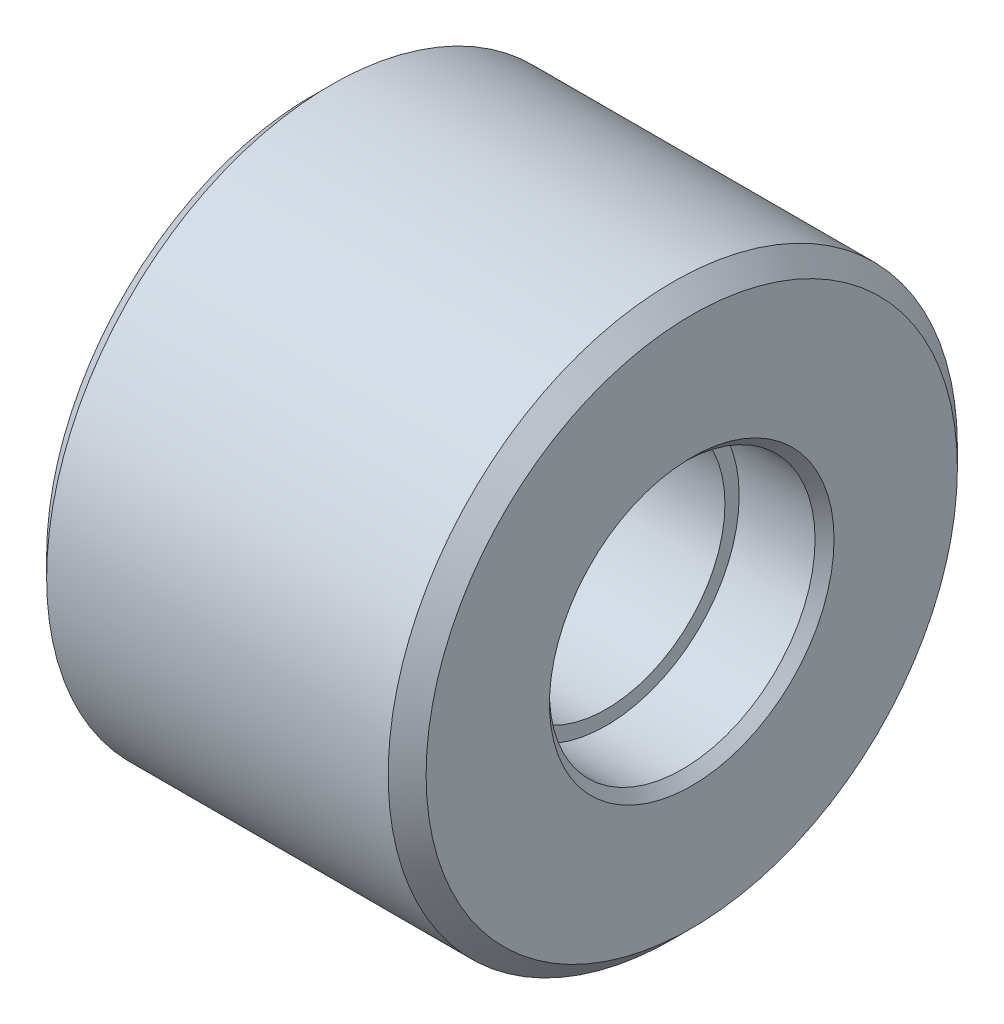
ISO-10303-21;
HEADER;
FILE_DESCRIPTION(('STEP AP214'),'2;1');
FILE_NAME('part.step','',(''),(''),'','','');
FILE_SCHEMA(('AUTOMOTIVE_DESIGN { 1 0 10303 214 1 1 1 1 }'));
ENDSEC;
DATA;
#1=APPLICATION_CONTEXT('core data for automotive mechanical design processes');
#2=APPLICATION_PROTOCOL_DEFINITION('international standard','automotive_design',2000,#1);
#3=PRODUCT_CONTEXT('',#1,'mechanical');
#4=PRODUCT('Part','Part','',(#3));
#5=PRODUCT_RELATED_PRODUCT_CATEGORY('part','',(#4));
#6=PRODUCT_DEFINITION_FORMATION('','',#4);
#7=PRODUCT_DEFINITION_CONTEXT('part definition',#1,'design');
#8=PRODUCT_DEFINITION('design','',#6,#7);
#9=PRODUCT_DEFINITION_SHAPE('','',#8);
#10=(LENGTH_UNIT() NAMED_UNIT(*) SI_UNIT(.MILLI.,.METRE.));
#11=(NAMED_UNIT(*) PLANE_ANGLE_UNIT() SI_UNIT($,.RADIAN.));
#12=(NAMED_UNIT(*) SI_UNIT($,.STERADIAN.) SOLID_ANGLE_UNIT());
#13=UNCERTAINTY_MEASURE_WITH_UNIT(LENGTH_MEASURE(1.E-05),#10,'distance_accuracy_value','');
#14=(GEOMETRIC_REPRESENTATION_CONTEXT(3) GLOBAL_UNCERTAINTY_ASSIGNED_CONTEXT((#13)) GLOBAL_UNIT_ASSIGNED_CONTEXT((#10,
#11,#12)) REPRESENTATION_CONTEXT('',''));
#15=CARTESIAN_POINT('',(0.,0.,0.));
#16=DIRECTION('',(0.,0.,1.));
#17=DIRECTION('',(1.,0.,0.));
#18=AXIS2_PLACEMENT_3D('',#15,#16,#17);
#19=CARTESIAN_POINT('',(-20.,14.,0.));
#20=DIRECTION('',(-1.,0.,0.));
#21=DIRECTION('',(0.,0.,1.));
#22=AXIS2_PLACEMENT_3D('',#19,#20,#21);
#23=PLANE('',#22);
#24=CARTESIAN_POINT('',(-20.,0.,0.));
#25=DIRECTION('',(-1.,0.,0.));
#26=DIRECTION('',(0.,0.,1.));
#27=AXIS2_PLACEMENT_3D('',#24,#25,#26);
#28=CIRCLE('',#27,15.);
#29=CARTESIAN_POINT('',(-20.,0.,15.));
#30=VERTEX_POINT('',#29);
#31=EDGE_CURVE('E55',#30,#30,#28,.F.);
#32=ORIENTED_EDGE('',*,*,#31,.T.);
#33=EDGE_LOOP('',(#32));
#34=FACE_BOUND('',#33,.T.);
#35=CARTESIAN_POINT('',(-20.,0.,0.));
#36=DIRECTION('',(-1.,0.,0.));
#37=DIRECTION('',(0.,0.,1.));
#38=AXIS2_PLACEMENT_3D('',#35,#36,#37);
#39=CIRCLE('',#38,28.);
#40=CARTESIAN_POINT('',(-20.,0.,28.));
#41=VERTEX_POINT('',#40);
#42=EDGE_CURVE('E71',#41,#41,#39,.T.);
#43=ORIENTED_EDGE('',*,*,#42,.T.);
#44=EDGE_LOOP('',(#43));
#45=FACE_BOUND('',#44,.T.);
#46=ADVANCED_FACE('F47',(#34,#45),#23,.T.);
#47=CARTESIAN_POINT('',(0.,0.,0.));
#48=DIRECTION('',(1.,0.,0.));
#49=DIRECTION('',(0.,0.,-1.));
#50=AXIS2_PLACEMENT_3D('',#47,#48,#49);
#51=CYLINDRICAL_SURFACE('',#50,30.);
#52=CARTESIAN_POINT('',(-18.,0.,0.));
#53=DIRECTION('',(-1.,0.,0.));
#54=DIRECTION('',(0.,0.,1.));
#55=AXIS2_PLACEMENT_3D('',#52,#53,#54);
#56=CIRCLE('',#55,30.);
#57=CARTESIAN_POINT('',(-18.,0.,30.));
#58=VERTEX_POINT('',#57);
#59=EDGE_CURVE('E74',#58,#58,#56,.F.);
#60=ORIENTED_EDGE('',*,*,#59,.T.);
#61=EDGE_LOOP('',(#60));
#62=FACE_BOUND('',#61,.T.);
#63=CARTESIAN_POINT('',(18.,0.,0.));
#64=DIRECTION('',(1.,0.,0.));
#65=DIRECTION('',(0.,0.,-1.));
#66=AXIS2_PLACEMENT_3D('',#63,#64,#65);
#67=CIRCLE('',#66,30.);
#68=CARTESIAN_POINT('',(18.,0.,-30.));
#69=VERTEX_POINT('',#68);
#70=EDGE_CURVE('E77',#69,#69,#67,.F.);
#71=ORIENTED_EDGE('',*,*,#70,.T.);
#72=EDGE_LOOP('',(#71));
#73=FACE_BOUND('',#72,.T.);
#74=ADVANCED_FACE('F110',(#62,#73),#51,.T.);
#75=CARTESIAN_POINT('',(20.,30.,0.));
#76=DIRECTION('',(1.,0.,0.));
#77=DIRECTION('',(0.,0.,-1.));
#78=AXIS2_PLACEMENT_3D('',#75,#76,#77);
#79=PLANE('',#78);
#80=CARTESIAN_POINT('',(20.,0.,0.));
#81=DIRECTION('',(1.,0.,0.));
#82=DIRECTION('',(0.,0.,-1.));
#83=AXIS2_PLACEMENT_3D('',#80,#81,#82);
#84=CIRCLE('',#83,15.);
#85=CARTESIAN_POINT('',(20.,0.,-15.));
#86=VERTEX_POINT('',#85);
#87=EDGE_CURVE('E59',#86,#86,#84,.F.);
#88=ORIENTED_EDGE('',*,*,#87,.T.);
#89=EDGE_LOOP('',(#88));
#90=FACE_BOUND('',#89,.T.);
#91=CARTESIAN_POINT('',(20.,0.,0.));
#92=DIRECTION('',(1.,0.,0.));
#93=DIRECTION('',(0.,0.,-1.));
#94=AXIS2_PLACEMENT_3D('',#91,#92,#93);
#95=CIRCLE('',#94,28.);
#96=CARTESIAN_POINT('',(20.,0.,-28.));
#97=VERTEX_POINT('',#96);
#98=EDGE_CURVE('E68',#97,#97,#95,.T.);
#99=ORIENTED_EDGE('',*,*,#98,.T.);
#100=EDGE_LOOP('',(#99));
#101=FACE_BOUND('',#100,.T.);
#102=ADVANCED_FACE('F115',(#90,#101),#79,.T.);
#103=CARTESIAN_POINT('',(0.,0.,0.));
#104=DIRECTION('',(1.,0.,0.));
#105=DIRECTION('',(0.,0.,-1.));
#106=AXIS2_PLACEMENT_3D('',#103,#104,#105);
#107=CYLINDRICAL_SURFACE('',#106,14.);
#108=CARTESIAN_POINT('',(19.,0.,0.));
#109=DIRECTION('',(1.,0.,0.));
#110=DIRECTION('',(0.,0.,-1.));
#111=AXIS2_PLACEMENT_3D('',#108,#109,#110);
#112=CIRCLE('',#111,14.);
#113=CARTESIAN_POINT('',(19.,0.,-14.));
#114=VERTEX_POINT('',#113);
#115=EDGE_CURVE('E63',#114,#114,#112,.T.);
#116=ORIENTED_EDGE('',*,*,#115,.T.);
#117=EDGE_LOOP('',(#116));
#118=FACE_BOUND('',#117,.T.);
#119=CARTESIAN_POINT('',(11.,0.,0.));
#120=DIRECTION('',(1.,0.,0.));
#121=DIRECTION('',(0.,0.,-1.));
#122=AXIS2_PLACEMENT_3D('',#119,#120,#121);
#123=CIRCLE('',#122,14.);
#124=CARTESIAN_POINT('',(11.,0.,-14.));
#125=VERTEX_POINT('',#124);
#126=EDGE_CURVE('E80',#125,#125,#123,.T.);
#127=ORIENTED_EDGE('',*,*,#126,.F.);
#128=EDGE_LOOP('',(#127));
#129=FACE_BOUND('',#128,.T.);
#130=ADVANCED_FACE('F147',(#118,#129),#107,.F.);
#131=CARTESIAN_POINT('',(11.,12.5,0.));
#132=DIRECTION('',(1.,0.,0.));
#133=DIRECTION('',(0.,0.,-1.));
#134=AXIS2_PLACEMENT_3D('',#131,#132,#133);
#135=PLANE('',#134);
#136=ORIENTED_EDGE('',*,*,#126,.T.);
#137=EDGE_LOOP('',(#136));
#138=FACE_BOUND('',#137,.T.);
#139=CARTESIAN_POINT('',(11.,0.,0.));
#140=DIRECTION('',(1.,0.,0.));
#141=DIRECTION('',(0.,0.,-1.));
#142=AXIS2_PLACEMENT_3D('',#139,#140,#141);
#143=CIRCLE('',#142,12.5);
#144=CARTESIAN_POINT('',(11.,0.,-12.5));
#145=VERTEX_POINT('',#144);
#146=EDGE_CURVE('E83',#145,#145,#143,.T.);
#147=ORIENTED_EDGE('',*,*,#146,.F.);
#148=EDGE_LOOP('',(#147));
#149=FACE_BOUND('',#148,.T.);
#150=ADVANCED_FACE('F106',(#138,#149),#135,.T.);
#151=CARTESIAN_POINT('',(0.,0.,0.));
#152=DIRECTION('',(1.,0.,0.));
#153=DIRECTION('',(0.,0.,-1.));
#154=AXIS2_PLACEMENT_3D('',#151,#152,#153);
#155=CYLINDRICAL_SURFACE('',#154,12.5);
#156=ORIENTED_EDGE('',*,*,#146,.T.);
#157=EDGE_LOOP('',(#156));
#158=FACE_BOUND('',#157,.T.);
#159=CARTESIAN_POINT('',(-11.,0.,0.));
#160=DIRECTION('',(1.,0.,0.));
#161=DIRECTION('',(0.,0.,-1.));
#162=AXIS2_PLACEMENT_3D('',#159,#160,#161);
#163=CIRCLE('',#162,12.5);
#164=CARTESIAN_POINT('',(-11.,0.,-12.5));
#165=VERTEX_POINT('',#164);
#166=EDGE_CURVE('E86',#165,#165,#163,.T.);
#167=ORIENTED_EDGE('',*,*,#166,.F.);
#168=EDGE_LOOP('',(#167));
#169=FACE_BOUND('',#168,.T.);
#170=ADVANCED_FACE('F97',(#158,#169),#155,.F.);
#171=CARTESIAN_POINT('',(-11.,14.,0.));
#172=DIRECTION('',(-1.,0.,0.));
#173=DIRECTION('',(0.,0.,1.));
#174=AXIS2_PLACEMENT_3D('',#171,#172,#173);
#175=PLANE('',#174);
#176=ORIENTED_EDGE('',*,*,#166,.T.);
#177=EDGE_LOOP('',(#176));
#178=FACE_BOUND('',#177,.T.);
#179=CARTESIAN_POINT('',(-11.,0.,0.));
#180=DIRECTION('',(1.,0.,0.));
#181=DIRECTION('',(0.,0.,-1.));
#182=AXIS2_PLACEMENT_3D('',#179,#180,#181);
#183=CIRCLE('',#182,14.);
#184=CARTESIAN_POINT('',(-11.,0.,-14.));
#185=VERTEX_POINT('',#184);
#186=EDGE_CURVE('E89',#185,#185,#183,.T.);
#187=ORIENTED_EDGE('',*,*,#186,.F.);
#188=EDGE_LOOP('',(#187));
#189=FACE_BOUND('',#188,.T.);
#190=ADVANCED_FACE('F95',(#178,#189),#175,.T.);
#191=CARTESIAN_POINT('',(0.,0.,0.));
#192=DIRECTION('',(1.,0.,0.));
#193=DIRECTION('',(0.,0.,-1.));
#194=AXIS2_PLACEMENT_3D('',#191,#192,#193);
#195=CYLINDRICAL_SURFACE('',#194,14.);
#196=CARTESIAN_POINT('',(-19.,0.,0.));
#197=DIRECTION('',(-1.,0.,0.));
#198=DIRECTION('',(0.,0.,1.));
#199=AXIS2_PLACEMENT_3D('',#196,#197,#198);
#200=CIRCLE('',#199,14.);
#201=CARTESIAN_POINT('',(-19.,0.,14.));
#202=VERTEX_POINT('',#201);
#203=EDGE_CURVE('E10',#202,#202,#200,.T.);
#204=ORIENTED_EDGE('',*,*,#203,.T.);
#205=EDGE_LOOP('',(#204));
#206=FACE_BOUND('',#205,.T.);
#207=ORIENTED_EDGE('',*,*,#186,.T.);
#208=EDGE_LOOP('',(#207));
#209=FACE_BOUND('',#208,.T.);
#210=ADVANCED_FACE('F93',(#206,#209),#195,.F.);
#211=CARTESIAN_POINT('',(-18.,0.,0.));
#212=DIRECTION('',(1.,0.,0.));
#213=DIRECTION('',(0.,0.,-1.));
#214=AXIS2_PLACEMENT_3D('',#211,#212,#213);
#215=CONICAL_SURFACE('',#214,30.,0.785398163397452);
#216=ORIENTED_EDGE('',*,*,#42,.F.);
#217=EDGE_LOOP('',(#216));
#218=FACE_BOUND('',#217,.T.);
#219=ORIENTED_EDGE('',*,*,#59,.F.);
#220=EDGE_LOOP('',(#219));
#221=FACE_BOUND('',#220,.T.);
#222=ADVANCED_FACE('F104',(#218,#221),#215,.T.);
#223=CARTESIAN_POINT('',(20.,0.,0.));
#224=DIRECTION('',(-1.,0.,0.));
#225=DIRECTION('',(0.,0.,1.));
#226=AXIS2_PLACEMENT_3D('',#223,#224,#225);
#227=CONICAL_SURFACE('',#226,28.,0.785398163397447);
#228=ORIENTED_EDGE('',*,*,#70,.F.);
#229=EDGE_LOOP('',(#228));
#230=FACE_BOUND('',#229,.T.);
#231=ORIENTED_EDGE('',*,*,#98,.F.);
#232=EDGE_LOOP('',(#231));
#233=FACE_BOUND('',#232,.T.);
#234=ADVANCED_FACE('F127',(#230,#233),#227,.T.);
#235=CARTESIAN_POINT('',(19.,0.,0.));
#236=DIRECTION('',(1.,0.,0.));
#237=DIRECTION('',(0.,0.,-1.));
#238=AXIS2_PLACEMENT_3D('',#235,#236,#237);
#239=CONICAL_SURFACE('',#238,14.,0.785398163397451);
#240=ORIENTED_EDGE('',*,*,#87,.F.);
#241=EDGE_LOOP('',(#240));
#242=FACE_BOUND('',#241,.T.);
#243=ORIENTED_EDGE('',*,*,#115,.F.);
#244=EDGE_LOOP('',(#243));
#245=FACE_BOUND('',#244,.T.);
#246=ADVANCED_FACE('F133',(#242,#245),#239,.F.);
#247=CARTESIAN_POINT('',(-20.,0.,0.));
#248=DIRECTION('',(-1.,0.,0.));
#249=DIRECTION('',(0.,0.,1.));
#250=AXIS2_PLACEMENT_3D('',#247,#248,#249);
#251=CONICAL_SURFACE('',#250,15.,0.785398163397441);
#252=ORIENTED_EDGE('',*,*,#203,.F.);
#253=EDGE_LOOP('',(#252));
#254=FACE_BOUND('',#253,.T.);
#255=ORIENTED_EDGE('',*,*,#31,.F.);
#256=EDGE_LOOP('',(#255));
#257=FACE_BOUND('',#256,.T.);
#258=ADVANCED_FACE('F50',(#254,#257),#251,.F.);
#259=CLOSED_SHELL('',(#46,#74,#102,#130,#150,#170,#190,#210,#222,#234,#246,#258));
#260=MANIFOLD_SOLID_BREP('B2',#259);
#261=ADVANCED_BREP_SHAPE_REPRESENTATION('',(#18,#260),#14);
#262=SHAPE_DEFINITION_REPRESENTATION(#9,#261);
ENDSEC;
END-ISO-10303-21;
